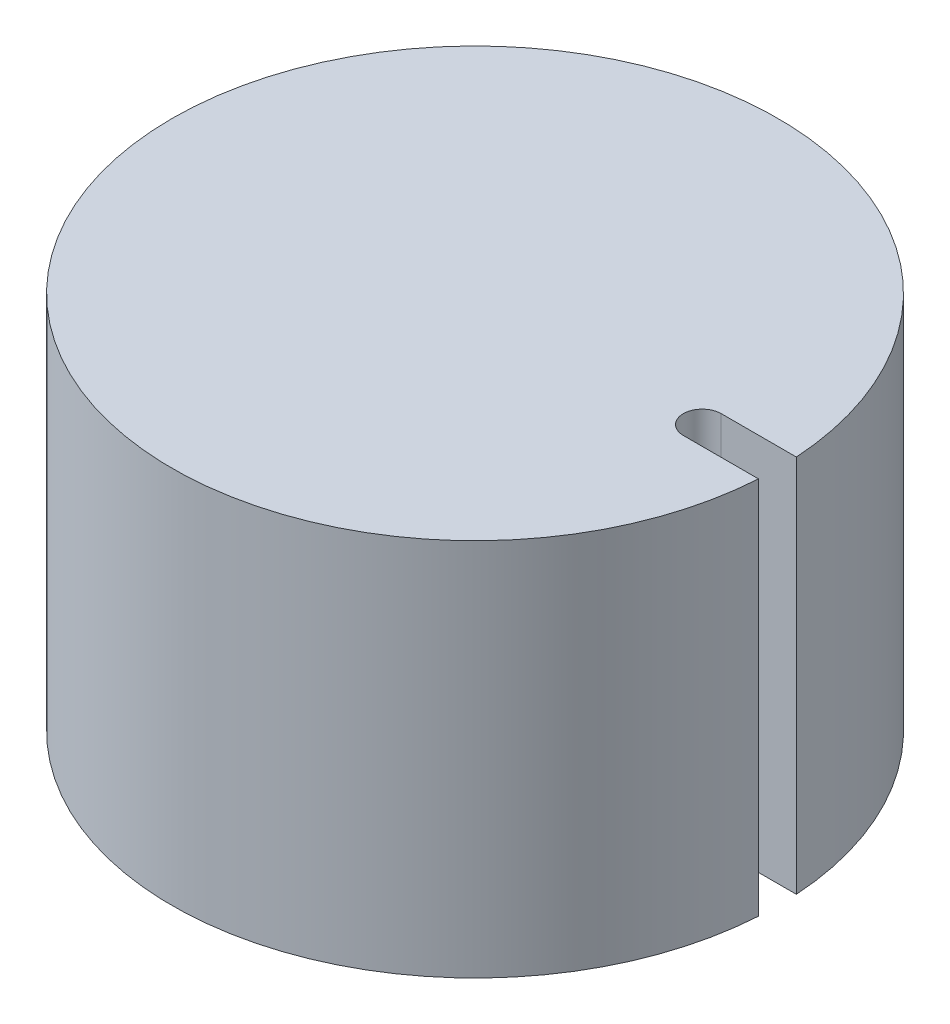
ISO-10303-21;
HEADER;
FILE_DESCRIPTION(('STEP AP214'),'2;1');
FILE_NAME('part.step','',(''),(''),'','','');
FILE_SCHEMA(('AUTOMOTIVE_DESIGN { 1 0 10303 214 1 1 1 1 }'));
ENDSEC;
DATA;
#1=APPLICATION_CONTEXT('core data for automotive mechanical design processes');
#2=APPLICATION_PROTOCOL_DEFINITION('international standard','automotive_design',2000,#1);
#3=PRODUCT_CONTEXT('',#1,'mechanical');
#4=PRODUCT('Part','Part','',(#3));
#5=PRODUCT_RELATED_PRODUCT_CATEGORY('part','',(#4));
#6=PRODUCT_DEFINITION_FORMATION('','',#4);
#7=PRODUCT_DEFINITION_CONTEXT('part definition',#1,'design');
#8=PRODUCT_DEFINITION('design','',#6,#7);
#9=PRODUCT_DEFINITION_SHAPE('','',#8);
#10=(LENGTH_UNIT() NAMED_UNIT(*) SI_UNIT(.MILLI.,.METRE.));
#11=(NAMED_UNIT(*) PLANE_ANGLE_UNIT() SI_UNIT($,.RADIAN.));
#12=(NAMED_UNIT(*) SI_UNIT($,.STERADIAN.) SOLID_ANGLE_UNIT());
#13=UNCERTAINTY_MEASURE_WITH_UNIT(LENGTH_MEASURE(1.E-05),#10,'distance_accuracy_value','');
#14=(GEOMETRIC_REPRESENTATION_CONTEXT(3) GLOBAL_UNCERTAINTY_ASSIGNED_CONTEXT((#13)) GLOBAL_UNIT_ASSIGNED_CONTEXT((#10,
#11,#12)) REPRESENTATION_CONTEXT('',''));
#15=CARTESIAN_POINT('',(0.,0.,0.));
#16=DIRECTION('',(0.,0.,1.));
#17=DIRECTION('',(1.,0.,0.));
#18=AXIS2_PLACEMENT_3D('',#15,#16,#17);
#19=CARTESIAN_POINT('',(0.,50.,0.));
#20=DIRECTION('',(0.,1.,0.));
#21=DIRECTION('',(0.,0.,1.));
#22=AXIS2_PLACEMENT_3D('',#19,#20,#21);
#23=PLANE('',#22);
#24=CARTESIAN_POINT('',(30.,50.,0.));
#25=DIRECTION('',(0.,-1.,0.));
#26=DIRECTION('',(0.,0.,-1.));
#27=AXIS2_PLACEMENT_3D('',#24,#25,#26);
#28=CIRCLE('',#27,2.5);
#29=CARTESIAN_POINT('',(30.,50.,2.5));
#30=VERTEX_POINT('',#29);
#31=CARTESIAN_POINT('',(30.,50.,-2.5));
#32=VERTEX_POINT('',#31);
#33=EDGE_CURVE('E118',#30,#32,#28,.T.);
#34=ORIENTED_EDGE('',*,*,#33,.T.);
#35=DIRECTION('',(1.,0.,0.));
#36=VECTOR('',#35,1.);
#37=CARTESIAN_POINT('',(40.,50.,-2.5));
#38=LINE('',#37,#36);
#39=CARTESIAN_POINT('',(39.9217985566783,50.,-2.5));
#40=VERTEX_POINT('',#39);
#41=EDGE_CURVE('E114',#32,#40,#38,.T.);
#42=ORIENTED_EDGE('',*,*,#41,.T.);
#43=CARTESIAN_POINT('',(0.,50.,0.));
#44=DIRECTION('',(0.,1.,0.));
#45=DIRECTION('',(0.,0.,1.));
#46=AXIS2_PLACEMENT_3D('',#43,#44,#45);
#47=CIRCLE('',#46,40.);
#48=CARTESIAN_POINT('',(39.9217985566783,50.,2.5));
#49=VERTEX_POINT('',#48);
#50=EDGE_CURVE('E49',#40,#49,#47,.T.);
#51=ORIENTED_EDGE('',*,*,#50,.T.);
#52=DIRECTION('',(-1.,0.,0.));
#53=VECTOR('',#52,1.);
#54=CARTESIAN_POINT('',(40.,50.,2.5));
#55=LINE('',#54,#53);
#56=EDGE_CURVE('E107',#49,#30,#55,.T.);
#57=ORIENTED_EDGE('',*,*,#56,.T.);
#58=EDGE_LOOP('',(#34,#42,#51,#57));
#59=FACE_BOUND('',#58,.T.);
#60=ADVANCED_FACE('F41',(#59),#23,.T.);
#61=CARTESIAN_POINT('',(0.,0.,0.));
#62=DIRECTION('',(0.,1.,0.));
#63=DIRECTION('',(0.,0.,1.));
#64=AXIS2_PLACEMENT_3D('',#61,#62,#63);
#65=PLANE('',#64);
#66=DIRECTION('',(-1.,0.,0.));
#67=VECTOR('',#66,1.);
#68=CARTESIAN_POINT('',(18.5404962177392,0.,7.49999999999999));
#69=LINE('',#68,#67);
#70=CARTESIAN_POINT('',(25.,0.,7.5));
#71=VERTEX_POINT('',#70);
#72=CARTESIAN_POINT('',(18.5404962177392,0.,7.49999999999999));
#73=VERTEX_POINT('',#72);
#74=EDGE_CURVE('E155',#71,#73,#69,.T.);
#75=ORIENTED_EDGE('',*,*,#74,.F.);
#76=DIRECTION('',(0.,0.,1.));
#77=VECTOR('',#76,1.);
#78=CARTESIAN_POINT('',(25.,0.,7.5));
#79=LINE('',#78,#77);
#80=CARTESIAN_POINT('',(25.,0.,-7.5));
#81=VERTEX_POINT('',#80);
#82=EDGE_CURVE('E61',#81,#71,#79,.T.);
#83=ORIENTED_EDGE('',*,*,#82,.F.);
#84=DIRECTION('',(1.,0.,0.));
#85=VECTOR('',#84,1.);
#86=CARTESIAN_POINT('',(18.5404962177392,0.,-7.5));
#87=LINE('',#86,#85);
#88=CARTESIAN_POINT('',(18.5404962177392,0.,-7.5));
#89=VERTEX_POINT('',#88);
#90=EDGE_CURVE('E143',#89,#81,#87,.T.);
#91=ORIENTED_EDGE('',*,*,#90,.F.);
#92=CARTESIAN_POINT('',(0.,0.,0.));
#93=DIRECTION('',(0.,-1.,0.));
#94=DIRECTION('',(0.,0.,-1.));
#95=AXIS2_PLACEMENT_3D('',#92,#93,#94);
#96=CIRCLE('',#95,20.);
#97=EDGE_CURVE('E154',#73,#89,#96,.T.);
#98=ORIENTED_EDGE('',*,*,#97,.F.);
#99=EDGE_LOOP('',(#75,#83,#91,#98));
#100=FACE_BOUND('',#99,.T.);
#101=DIRECTION('',(-1.,0.,0.));
#102=VECTOR('',#101,1.);
#103=CARTESIAN_POINT('',(40.,0.,2.5));
#104=LINE('',#103,#102);
#105=CARTESIAN_POINT('',(39.9217985566783,0.,2.5));
#106=VERTEX_POINT('',#105);
#107=CARTESIAN_POINT('',(30.,0.,2.5));
#108=VERTEX_POINT('',#107);
#109=EDGE_CURVE('E11',#106,#108,#104,.T.);
#110=ORIENTED_EDGE('',*,*,#109,.F.);
#111=CARTESIAN_POINT('',(0.,0.,0.));
#112=DIRECTION('',(0.,1.,0.));
#113=DIRECTION('',(0.,0.,1.));
#114=AXIS2_PLACEMENT_3D('',#111,#112,#113);
#115=CIRCLE('',#114,40.);
#116=CARTESIAN_POINT('',(39.9217985566783,0.,-2.5));
#117=VERTEX_POINT('',#116);
#118=EDGE_CURVE('E44',#117,#106,#115,.T.);
#119=ORIENTED_EDGE('',*,*,#118,.F.);
#120=DIRECTION('',(1.,0.,0.));
#121=VECTOR('',#120,1.);
#122=CARTESIAN_POINT('',(40.,0.,-2.5));
#123=LINE('',#122,#121);
#124=CARTESIAN_POINT('',(30.,0.,-2.5));
#125=VERTEX_POINT('',#124);
#126=EDGE_CURVE('E122',#125,#117,#123,.T.);
#127=ORIENTED_EDGE('',*,*,#126,.F.);
#128=CARTESIAN_POINT('',(30.,0.,0.));
#129=DIRECTION('',(0.,-1.,0.));
#130=DIRECTION('',(0.,0.,-1.));
#131=AXIS2_PLACEMENT_3D('',#128,#129,#130);
#132=CIRCLE('',#131,2.5);
#133=EDGE_CURVE('E127',#108,#125,#132,.T.);
#134=ORIENTED_EDGE('',*,*,#133,.F.);
#135=EDGE_LOOP('',(#110,#119,#127,#134));
#136=FACE_BOUND('',#135,.T.);
#137=ADVANCED_FACE('F173',(#100,#136),#65,.F.);
#138=CARTESIAN_POINT('',(0.,50.,0.));
#139=DIRECTION('',(0.,-1.,0.));
#140=DIRECTION('',(0.,0.,-1.));
#141=AXIS2_PLACEMENT_3D('',#138,#139,#140);
#142=CYLINDRICAL_SURFACE('',#141,40.);
#143=ORIENTED_EDGE('',*,*,#50,.F.);
#144=DIRECTION('',(0.,-1.,0.));
#145=VECTOR('',#144,1.);
#146=CARTESIAN_POINT('',(39.9217985566783,50.,-2.5));
#147=LINE('',#146,#145);
#148=EDGE_CURVE('E135',#40,#117,#147,.T.);
#149=ORIENTED_EDGE('',*,*,#148,.T.);
#150=ORIENTED_EDGE('',*,*,#118,.T.);
#151=DIRECTION('',(0.,-1.,0.));
#152=VECTOR('',#151,1.);
#153=CARTESIAN_POINT('',(39.9217985566783,50.,2.5));
#154=LINE('',#153,#152);
#155=EDGE_CURVE('E133',#106,#49,#154,.F.);
#156=ORIENTED_EDGE('',*,*,#155,.T.);
#157=EDGE_LOOP('',(#143,#149,#150,#156));
#158=FACE_BOUND('',#157,.T.);
#159=ADVANCED_FACE('F43',(#158),#142,.T.);
#160=CARTESIAN_POINT('',(25.,30.,7.5));
#161=DIRECTION('',(1.,0.,0.));
#162=DIRECTION('',(0.,0.,-1.));
#163=AXIS2_PLACEMENT_3D('',#160,#161,#162);
#164=PLANE('',#163);
#165=ORIENTED_EDGE('',*,*,#82,.T.);
#166=DIRECTION('',(0.,-1.,0.));
#167=VECTOR('',#166,1.);
#168=CARTESIAN_POINT('',(25.,30.,7.5));
#169=LINE('',#168,#167);
#170=CARTESIAN_POINT('',(25.,30.,7.5));
#171=VERTEX_POINT('',#170);
#172=EDGE_CURVE('E147',#171,#71,#169,.T.);
#173=ORIENTED_EDGE('',*,*,#172,.F.);
#174=DIRECTION('',(0.,0.,1.));
#175=VECTOR('',#174,1.);
#176=CARTESIAN_POINT('',(25.,30.,7.5));
#177=LINE('',#176,#175);
#178=CARTESIAN_POINT('',(25.,30.,-7.5));
#179=VERTEX_POINT('',#178);
#180=EDGE_CURVE('E140',#179,#171,#177,.T.);
#181=ORIENTED_EDGE('',*,*,#180,.F.);
#182=DIRECTION('',(0.,-1.,0.));
#183=VECTOR('',#182,1.);
#184=CARTESIAN_POINT('',(25.,30.,-7.5));
#185=LINE('',#184,#183);
#186=EDGE_CURVE('E159',#179,#81,#185,.T.);
#187=ORIENTED_EDGE('',*,*,#186,.T.);
#188=EDGE_LOOP('',(#165,#173,#181,#187));
#189=FACE_BOUND('',#188,.T.);
#190=ADVANCED_FACE('F192',(#189),#164,.F.);
#191=CARTESIAN_POINT('',(18.5404962177392,30.,-7.5));
#192=DIRECTION('',(0.,0.,-1.));
#193=DIRECTION('',(-1.,0.,0.));
#194=AXIS2_PLACEMENT_3D('',#191,#192,#193);
#195=PLANE('',#194);
#196=ORIENTED_EDGE('',*,*,#90,.T.);
#197=ORIENTED_EDGE('',*,*,#186,.F.);
#198=DIRECTION('',(1.,0.,0.));
#199=VECTOR('',#198,1.);
#200=CARTESIAN_POINT('',(18.5404962177392,30.,-7.5));
#201=LINE('',#200,#199);
#202=CARTESIAN_POINT('',(18.5404962177392,30.,-7.5));
#203=VERTEX_POINT('',#202);
#204=EDGE_CURVE('E150',#203,#179,#201,.T.);
#205=ORIENTED_EDGE('',*,*,#204,.F.);
#206=DIRECTION('',(0.,-1.,0.));
#207=VECTOR('',#206,1.);
#208=CARTESIAN_POINT('',(18.5404962177392,30.,-7.5));
#209=LINE('',#208,#207);
#210=EDGE_CURVE('E165',#203,#89,#209,.T.);
#211=ORIENTED_EDGE('',*,*,#210,.T.);
#212=EDGE_LOOP('',(#196,#197,#205,#211));
#213=FACE_BOUND('',#212,.T.);
#214=ADVANCED_FACE('F197',(#213),#195,.F.);
#215=CARTESIAN_POINT('',(0.,30.,0.));
#216=DIRECTION('',(0.,-1.,0.));
#217=DIRECTION('',(0.,0.,-1.));
#218=AXIS2_PLACEMENT_3D('',#215,#216,#217);
#219=CYLINDRICAL_SURFACE('',#218,20.);
#220=ORIENTED_EDGE('',*,*,#97,.T.);
#221=ORIENTED_EDGE('',*,*,#210,.F.);
#222=CARTESIAN_POINT('',(0.,30.,0.));
#223=DIRECTION('',(0.,-1.,0.));
#224=DIRECTION('',(0.,0.,-1.));
#225=AXIS2_PLACEMENT_3D('',#222,#223,#224);
#226=CIRCLE('',#225,20.);
#227=CARTESIAN_POINT('',(18.5404962177392,30.,7.49999999999999));
#228=VERTEX_POINT('',#227);
#229=EDGE_CURVE('E145',#228,#203,#226,.T.);
#230=ORIENTED_EDGE('',*,*,#229,.F.);
#231=DIRECTION('',(0.,-1.,0.));
#232=VECTOR('',#231,1.);
#233=CARTESIAN_POINT('',(18.5404962177392,30.,7.49999999999999));
#234=LINE('',#233,#232);
#235=EDGE_CURVE('E163',#228,#73,#234,.T.);
#236=ORIENTED_EDGE('',*,*,#235,.T.);
#237=EDGE_LOOP('',(#220,#221,#230,#236));
#238=FACE_BOUND('',#237,.T.);
#239=ADVANCED_FACE('F199',(#238),#219,.F.);
#240=CARTESIAN_POINT('',(18.5404962177392,30.,7.49999999999999));
#241=DIRECTION('',(0.,0.,1.));
#242=DIRECTION('',(1.,0.,0.));
#243=AXIS2_PLACEMENT_3D('',#240,#241,#242);
#244=PLANE('',#243);
#245=ORIENTED_EDGE('',*,*,#74,.T.);
#246=ORIENTED_EDGE('',*,*,#235,.F.);
#247=DIRECTION('',(-1.,0.,0.));
#248=VECTOR('',#247,1.);
#249=CARTESIAN_POINT('',(18.5404962177392,30.,7.49999999999999));
#250=LINE('',#249,#248);
#251=EDGE_CURVE('E139',#171,#228,#250,.T.);
#252=ORIENTED_EDGE('',*,*,#251,.F.);
#253=ORIENTED_EDGE('',*,*,#172,.T.);
#254=EDGE_LOOP('',(#245,#246,#252,#253));
#255=FACE_BOUND('',#254,.T.);
#256=ADVANCED_FACE('F181',(#255),#244,.F.);
#257=CARTESIAN_POINT('',(0.,30.,0.));
#258=DIRECTION('',(0.,-1.,0.));
#259=DIRECTION('',(0.,0.,-1.));
#260=AXIS2_PLACEMENT_3D('',#257,#258,#259);
#261=PLANE('',#260);
#262=ORIENTED_EDGE('',*,*,#180,.T.);
#263=ORIENTED_EDGE('',*,*,#251,.T.);
#264=ORIENTED_EDGE('',*,*,#229,.T.);
#265=ORIENTED_EDGE('',*,*,#204,.T.);
#266=EDGE_LOOP('',(#262,#263,#264,#265));
#267=FACE_BOUND('',#266,.T.);
#268=ADVANCED_FACE('F171',(#267),#261,.T.);
#269=CARTESIAN_POINT('',(40.,50.,-2.5));
#270=DIRECTION('',(0.,0.,-1.));
#271=DIRECTION('',(-1.,0.,0.));
#272=AXIS2_PLACEMENT_3D('',#269,#270,#271);
#273=PLANE('',#272);
#274=ORIENTED_EDGE('',*,*,#41,.F.);
#275=DIRECTION('',(0.,-1.,0.));
#276=VECTOR('',#275,1.);
#277=CARTESIAN_POINT('',(30.,50.,-2.5));
#278=LINE('',#277,#276);
#279=EDGE_CURVE('E115',#32,#125,#278,.T.);
#280=ORIENTED_EDGE('',*,*,#279,.T.);
#281=ORIENTED_EDGE('',*,*,#126,.T.);
#282=ORIENTED_EDGE('',*,*,#148,.F.);
#283=EDGE_LOOP('',(#274,#280,#281,#282));
#284=FACE_BOUND('',#283,.T.);
#285=ADVANCED_FACE('F172',(#284),#273,.F.);
#286=CARTESIAN_POINT('',(40.,50.,2.5));
#287=DIRECTION('',(0.,0.,1.));
#288=DIRECTION('',(1.,0.,0.));
#289=AXIS2_PLACEMENT_3D('',#286,#287,#288);
#290=PLANE('',#289);
#291=ORIENTED_EDGE('',*,*,#109,.T.);
#292=DIRECTION('',(0.,-1.,0.));
#293=VECTOR('',#292,1.);
#294=CARTESIAN_POINT('',(30.,50.,2.5));
#295=LINE('',#294,#293);
#296=EDGE_CURVE('E59',#30,#108,#295,.T.);
#297=ORIENTED_EDGE('',*,*,#296,.F.);
#298=ORIENTED_EDGE('',*,*,#56,.F.);
#299=ORIENTED_EDGE('',*,*,#155,.F.);
#300=EDGE_LOOP('',(#291,#297,#298,#299));
#301=FACE_BOUND('',#300,.T.);
#302=ADVANCED_FACE('F106',(#301),#290,.F.);
#303=CARTESIAN_POINT('',(30.,50.,0.));
#304=DIRECTION('',(0.,-1.,0.));
#305=DIRECTION('',(0.,0.,-1.));
#306=AXIS2_PLACEMENT_3D('',#303,#304,#305);
#307=CYLINDRICAL_SURFACE('',#306,2.5);
#308=ORIENTED_EDGE('',*,*,#133,.T.);
#309=ORIENTED_EDGE('',*,*,#279,.F.);
#310=ORIENTED_EDGE('',*,*,#33,.F.);
#311=ORIENTED_EDGE('',*,*,#296,.T.);
#312=EDGE_LOOP('',(#308,#309,#310,#311));
#313=FACE_BOUND('',#312,.T.);
#314=ADVANCED_FACE('F119',(#313),#307,.F.);
#315=CLOSED_SHELL('',(#60,#137,#159,#190,#214,#239,#256,#268,#285,#302,#314));
#316=MANIFOLD_SOLID_BREP('B2',#315);
#317=ADVANCED_BREP_SHAPE_REPRESENTATION('',(#18,#316),#14);
#318=SHAPE_DEFINITION_REPRESENTATION(#9,#317);
ENDSEC;
END-ISO-10303-21;
